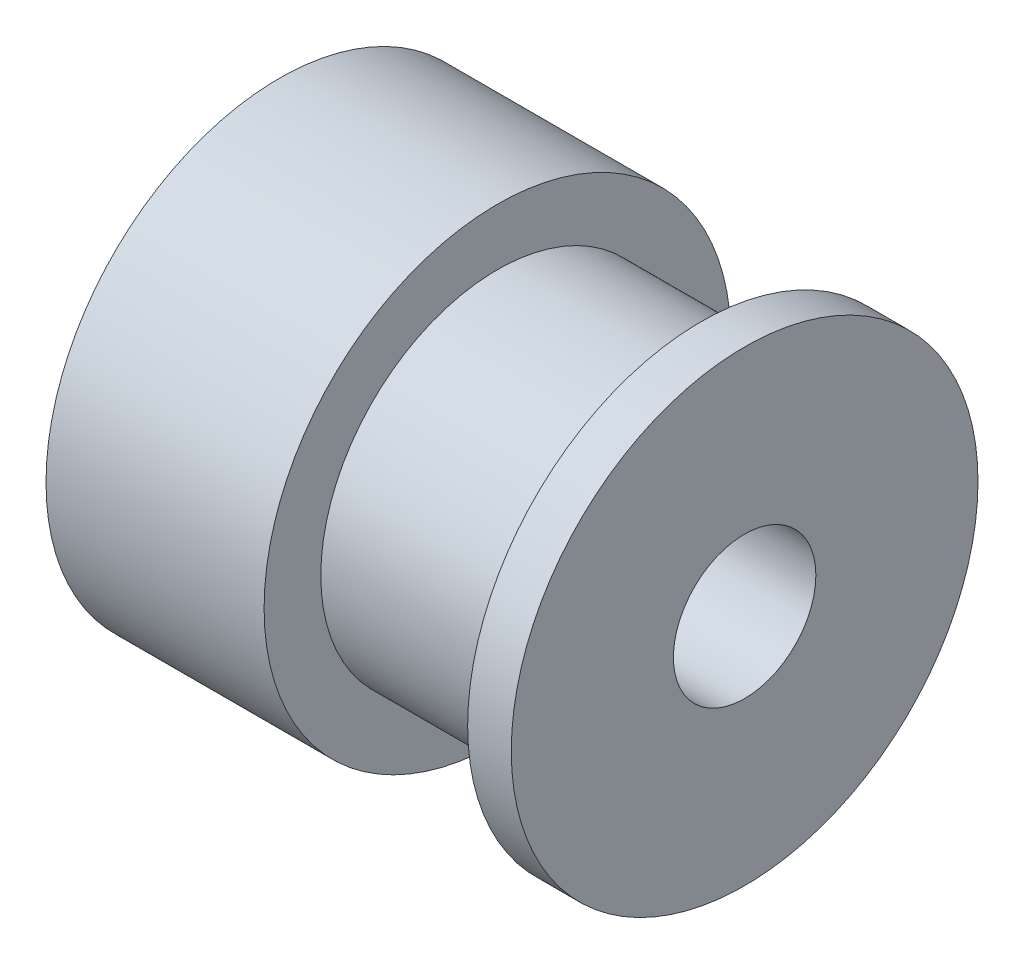
ISO-10303-21;
HEADER;
FILE_DESCRIPTION(('STEP AP214'),'2;1');
FILE_NAME('part.step','',(''),(''),'','','');
FILE_SCHEMA(('AUTOMOTIVE_DESIGN { 1 0 10303 214 1 1 1 1 }'));
ENDSEC;
DATA;
#1=APPLICATION_CONTEXT('core data for automotive mechanical design processes');
#2=APPLICATION_PROTOCOL_DEFINITION('international standard','automotive_design',2000,#1);
#3=PRODUCT_CONTEXT('',#1,'mechanical');
#4=PRODUCT('Part','Part','',(#3));
#5=PRODUCT_RELATED_PRODUCT_CATEGORY('part','',(#4));
#6=PRODUCT_DEFINITION_FORMATION('','',#4);
#7=PRODUCT_DEFINITION_CONTEXT('part definition',#1,'design');
#8=PRODUCT_DEFINITION('design','',#6,#7);
#9=PRODUCT_DEFINITION_SHAPE('','',#8);
#10=(LENGTH_UNIT() NAMED_UNIT(*) SI_UNIT(.MILLI.,.METRE.));
#11=(NAMED_UNIT(*) PLANE_ANGLE_UNIT() SI_UNIT($,.RADIAN.));
#12=(NAMED_UNIT(*) SI_UNIT($,.STERADIAN.) SOLID_ANGLE_UNIT());
#13=UNCERTAINTY_MEASURE_WITH_UNIT(LENGTH_MEASURE(1.E-05),#10,'distance_accuracy_value','');
#14=(GEOMETRIC_REPRESENTATION_CONTEXT(3) GLOBAL_UNCERTAINTY_ASSIGNED_CONTEXT((#13)) GLOBAL_UNIT_ASSIGNED_CONTEXT((#10,
#11,#12)) REPRESENTATION_CONTEXT('',''));
#15=CARTESIAN_POINT('',(0.,0.,0.));
#16=DIRECTION('',(0.,0.,1.));
#17=DIRECTION('',(1.,0.,0.));
#18=AXIS2_PLACEMENT_3D('',#15,#16,#17);
#19=CARTESIAN_POINT('',(16.,0.,0.));
#20=DIRECTION('',(-1.,0.,0.));
#21=DIRECTION('',(0.,0.,1.));
#22=AXIS2_PLACEMENT_3D('',#19,#20,#21);
#23=CYLINDRICAL_SURFACE('',#22,8.025);
#24=CARTESIAN_POINT('',(0.,0.,0.));
#25=DIRECTION('',(1.,0.,0.));
#26=DIRECTION('',(0.,0.,-1.));
#27=AXIS2_PLACEMENT_3D('',#24,#25,#26);
#28=CIRCLE('',#27,8.025);
#29=CARTESIAN_POINT('',(0.,0.,-8.025));
#30=VERTEX_POINT('',#29);
#31=EDGE_CURVE('E40',#30,#30,#28,.T.);
#32=ORIENTED_EDGE('',*,*,#31,.T.);
#33=EDGE_LOOP('',(#32));
#34=FACE_BOUND('',#33,.T.);
#35=CARTESIAN_POINT('',(7.5,0.,0.));
#36=DIRECTION('',(-1.,0.,0.));
#37=DIRECTION('',(0.,0.,1.));
#38=AXIS2_PLACEMENT_3D('',#35,#36,#37);
#39=CIRCLE('',#38,8.025);
#40=CARTESIAN_POINT('',(7.5,0.,8.025));
#41=VERTEX_POINT('',#40);
#42=EDGE_CURVE('E70',#41,#41,#39,.T.);
#43=ORIENTED_EDGE('',*,*,#42,.T.);
#44=EDGE_LOOP('',(#43));
#45=FACE_BOUND('',#44,.T.);
#46=ADVANCED_FACE('F37',(#34,#45),#23,.T.);
#47=CARTESIAN_POINT('',(16.,0.,0.));
#48=DIRECTION('',(1.,0.,0.));
#49=DIRECTION('',(0.,0.,-1.));
#50=AXIS2_PLACEMENT_3D('',#47,#48,#49);
#51=CIRCLE('',#50,8.025);
#52=CARTESIAN_POINT('',(16.,0.,-8.025));
#53=VERTEX_POINT('',#52);
#54=EDGE_CURVE('E10',#53,#53,#51,.T.);
#55=ORIENTED_EDGE('',*,*,#54,.F.);
#56=EDGE_LOOP('',(#55));
#57=FACE_BOUND('',#56,.T.);
#58=CARTESIAN_POINT('',(14.5,0.,0.));
#59=DIRECTION('',(-1.,0.,0.));
#60=DIRECTION('',(0.,0.,1.));
#61=AXIS2_PLACEMENT_3D('',#58,#59,#60);
#62=CIRCLE('',#61,8.025);
#63=CARTESIAN_POINT('',(14.5,0.,8.025));
#64=VERTEX_POINT('',#63);
#65=EDGE_CURVE('E66',#64,#64,#62,.T.);
#66=ORIENTED_EDGE('',*,*,#65,.F.);
#67=EDGE_LOOP('',(#66));
#68=FACE_BOUND('',#67,.T.);
#69=ADVANCED_FACE('F93',(#57,#68),#23,.T.);
#70=CARTESIAN_POINT('',(16.,0.,0.));
#71=DIRECTION('',(1.,0.,0.));
#72=DIRECTION('',(0.,0.,-1.));
#73=AXIS2_PLACEMENT_3D('',#70,#71,#72);
#74=PLANE('',#73);
#75=ORIENTED_EDGE('',*,*,#54,.T.);
#76=EDGE_LOOP('',(#75));
#77=FACE_BOUND('',#76,.T.);
#78=CARTESIAN_POINT('',(16.,0.,0.));
#79=DIRECTION('',(1.,0.,0.));
#80=DIRECTION('',(0.,0.,-1.));
#81=AXIS2_PLACEMENT_3D('',#78,#79,#80);
#82=CIRCLE('',#81,2.45);
#83=CARTESIAN_POINT('',(16.,0.,-2.45));
#84=VERTEX_POINT('',#83);
#85=EDGE_CURVE('E49',#84,#84,#82,.T.);
#86=ORIENTED_EDGE('',*,*,#85,.F.);
#87=EDGE_LOOP('',(#86));
#88=FACE_BOUND('',#87,.T.);
#89=ADVANCED_FACE('F98',(#77,#88),#74,.T.);
#90=CARTESIAN_POINT('',(0.,0.,0.));
#91=DIRECTION('',(1.,0.,0.));
#92=DIRECTION('',(0.,0.,-1.));
#93=AXIS2_PLACEMENT_3D('',#90,#91,#92);
#94=PLANE('',#93);
#95=ORIENTED_EDGE('',*,*,#31,.F.);
#96=EDGE_LOOP('',(#95));
#97=FACE_BOUND('',#96,.T.);
#98=CARTESIAN_POINT('',(0.,0.,0.));
#99=DIRECTION('',(1.,0.,0.));
#100=DIRECTION('',(0.,0.,-1.));
#101=AXIS2_PLACEMENT_3D('',#98,#99,#100);
#102=CIRCLE('',#101,2.45);
#103=CARTESIAN_POINT('',(0.,0.,-2.45));
#104=VERTEX_POINT('',#103);
#105=EDGE_CURVE('E51',#104,#104,#102,.T.);
#106=ORIENTED_EDGE('',*,*,#105,.T.);
#107=EDGE_LOOP('',(#106));
#108=FACE_BOUND('',#107,.T.);
#109=ADVANCED_FACE('F89',(#97,#108),#94,.F.);
#110=CARTESIAN_POINT('',(16.,0.,0.));
#111=DIRECTION('',(-1.,0.,0.));
#112=DIRECTION('',(0.,0.,1.));
#113=AXIS2_PLACEMENT_3D('',#110,#111,#112);
#114=CYLINDRICAL_SURFACE('',#113,2.45);
#115=ORIENTED_EDGE('',*,*,#85,.T.);
#116=EDGE_LOOP('',(#115));
#117=FACE_BOUND('',#116,.T.);
#118=ORIENTED_EDGE('',*,*,#105,.F.);
#119=EDGE_LOOP('',(#118));
#120=FACE_BOUND('',#119,.T.);
#121=ADVANCED_FACE('F79',(#117,#120),#114,.F.);
#122=CARTESIAN_POINT('',(7.5,8.025,0.));
#123=DIRECTION('',(1.,0.,0.));
#124=DIRECTION('',(0.,0.,-1.));
#125=AXIS2_PLACEMENT_3D('',#122,#123,#124);
#126=PLANE('',#125);
#127=CARTESIAN_POINT('',(7.5,0.,0.));
#128=DIRECTION('',(-1.,0.,0.));
#129=DIRECTION('',(0.,0.,1.));
#130=AXIS2_PLACEMENT_3D('',#127,#128,#129);
#131=CIRCLE('',#130,6.075);
#132=CARTESIAN_POINT('',(7.5,0.,6.075));
#133=VERTEX_POINT('',#132);
#134=EDGE_CURVE('E55',#133,#133,#131,.T.);
#135=ORIENTED_EDGE('',*,*,#134,.T.);
#136=EDGE_LOOP('',(#135));
#137=FACE_BOUND('',#136,.T.);
#138=ORIENTED_EDGE('',*,*,#42,.F.);
#139=EDGE_LOOP('',(#138));
#140=FACE_BOUND('',#139,.T.);
#141=ADVANCED_FACE('F76',(#137,#140),#126,.T.);
#142=CARTESIAN_POINT('',(-1.78425414845494,0.,0.));
#143=DIRECTION('',(-1.,0.,0.));
#144=DIRECTION('',(0.,0.,1.));
#145=AXIS2_PLACEMENT_3D('',#142,#143,#144);
#146=CYLINDRICAL_SURFACE('',#145,6.075);
#147=CARTESIAN_POINT('',(14.5,0.,0.));
#148=DIRECTION('',(-1.,0.,0.));
#149=DIRECTION('',(0.,0.,1.));
#150=AXIS2_PLACEMENT_3D('',#147,#148,#149);
#151=CIRCLE('',#150,6.075);
#152=CARTESIAN_POINT('',(14.5,0.,6.075));
#153=VERTEX_POINT('',#152);
#154=EDGE_CURVE('E62',#153,#153,#151,.T.);
#155=ORIENTED_EDGE('',*,*,#154,.T.);
#156=EDGE_LOOP('',(#155));
#157=FACE_BOUND('',#156,.T.);
#158=ORIENTED_EDGE('',*,*,#134,.F.);
#159=EDGE_LOOP('',(#158));
#160=FACE_BOUND('',#159,.T.);
#161=ADVANCED_FACE('F78',(#157,#160),#146,.T.);
#162=CARTESIAN_POINT('',(14.5,8.025,0.));
#163=DIRECTION('',(-1.,0.,0.));
#164=DIRECTION('',(0.,0.,1.));
#165=AXIS2_PLACEMENT_3D('',#162,#163,#164);
#166=PLANE('',#165);
#167=ORIENTED_EDGE('',*,*,#65,.T.);
#168=EDGE_LOOP('',(#167));
#169=FACE_BOUND('',#168,.T.);
#170=ORIENTED_EDGE('',*,*,#154,.F.);
#171=EDGE_LOOP('',(#170));
#172=FACE_BOUND('',#171,.T.);
#173=ADVANCED_FACE('F86',(#169,#172),#166,.T.);
#174=CLOSED_SHELL('',(#46,#69,#89,#109,#121,#141,#161,#173));
#175=MANIFOLD_SOLID_BREP('B2',#174);
#176=ADVANCED_BREP_SHAPE_REPRESENTATION('',(#18,#175),#14);
#177=SHAPE_DEFINITION_REPRESENTATION(#9,#176);
ENDSEC;
END-ISO-10303-21;
